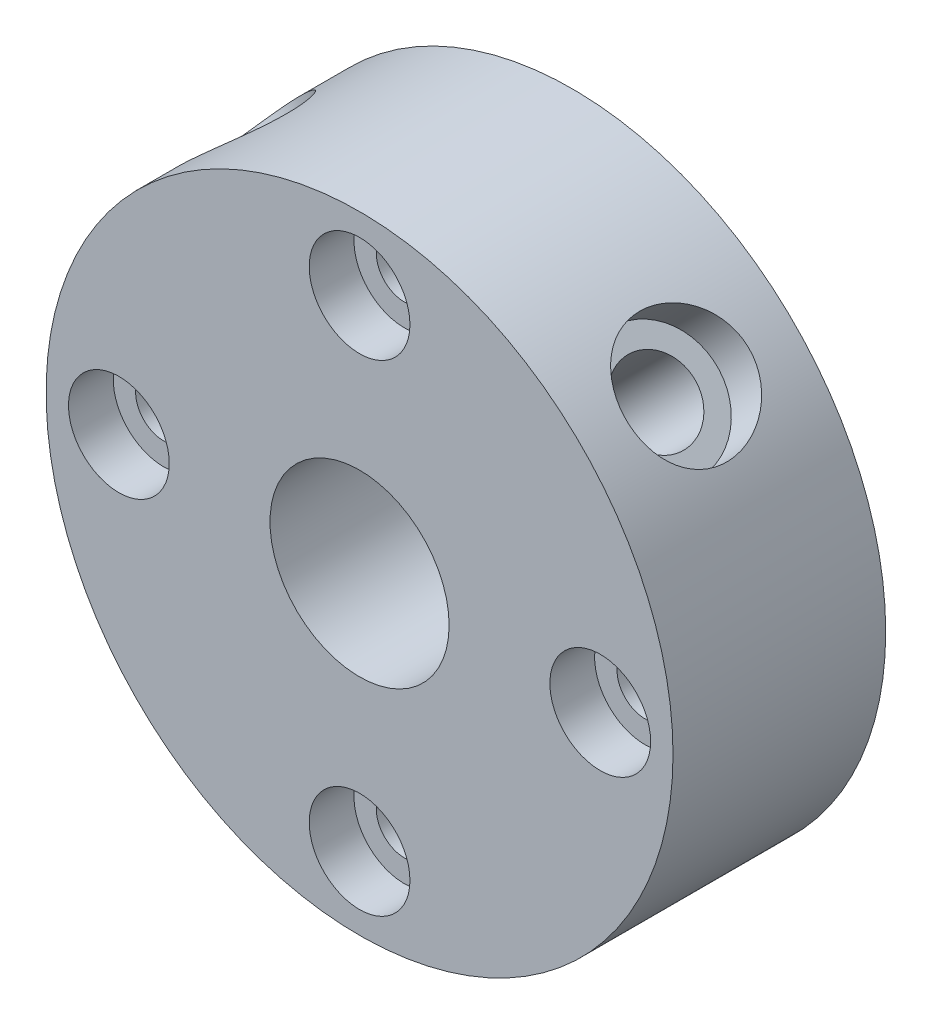
ISO-10303-21;
HEADER;
FILE_DESCRIPTION(('STEP AP214'),'2;1');
FILE_NAME('part.step','',(''),(''),'','','');
FILE_SCHEMA(('AUTOMOTIVE_DESIGN { 1 0 10303 214 1 1 1 1 }'));
ENDSEC;
DATA;
#1=APPLICATION_CONTEXT('core data for automotive mechanical design processes');
#2=APPLICATION_PROTOCOL_DEFINITION('international standard','automotive_design',2000,#1);
#3=PRODUCT_CONTEXT('',#1,'mechanical');
#4=PRODUCT('Part','Part','',(#3));
#5=PRODUCT_RELATED_PRODUCT_CATEGORY('part','',(#4));
#6=PRODUCT_DEFINITION_FORMATION('','',#4);
#7=PRODUCT_DEFINITION_CONTEXT('part definition',#1,'design');
#8=PRODUCT_DEFINITION('design','',#6,#7);
#9=PRODUCT_DEFINITION_SHAPE('','',#8);
#10=(LENGTH_UNIT() NAMED_UNIT(*) SI_UNIT(.MILLI.,.METRE.));
#11=(NAMED_UNIT(*) PLANE_ANGLE_UNIT() SI_UNIT($,.RADIAN.));
#12=(NAMED_UNIT(*) SI_UNIT($,.STERADIAN.) SOLID_ANGLE_UNIT());
#13=UNCERTAINTY_MEASURE_WITH_UNIT(LENGTH_MEASURE(1.E-05),#10,'distance_accuracy_value','');
#14=(GEOMETRIC_REPRESENTATION_CONTEXT(3) GLOBAL_UNCERTAINTY_ASSIGNED_CONTEXT((#13)) GLOBAL_UNIT_ASSIGNED_CONTEXT((#10,
#11,#12)) REPRESENTATION_CONTEXT('',''));
#15=CARTESIAN_POINT('',(0.,0.,0.));
#16=DIRECTION('',(0.,0.,1.));
#17=DIRECTION('',(1.,0.,0.));
#18=AXIS2_PLACEMENT_3D('',#15,#16,#17);
#19=CARTESIAN_POINT('',(0.707106781186545,-0.707106781186545,5.));
#20=DIRECTION('',(-0.707106781186549,0.707106781186546,0.));
#21=DIRECTION('',(-0.707106781186546,-0.707106781186549,0.));
#22=AXIS2_PLACEMENT_3D('',#19,#20,#21);
#23=CYLINDRICAL_SURFACE('',#22,1.75);
#24=CARTESIAN_POINT('',(-3.78081061074844,1.30593687659551,5.));
#25=CARTESIAN_POINT('',(-3.78081084278858,1.3059430821465,4.90716289442287));
#26=CARTESIAN_POINT('',(-3.77813198257498,1.31377205584543,4.81417157119662));
#27=CARTESIAN_POINT('',(-3.76729717141992,1.34451664459764,4.63091468094084));
#28=CARTESIAN_POINT('',(-3.75912707279636,1.36747122641772,4.54065678566668));
#29=CARTESIAN_POINT('',(-3.73703736828537,1.42672253507604,4.3658460553758));
#30=CARTESIAN_POINT('',(-3.72314281251786,1.46296105639329,4.28127020835369));
#31=CARTESIAN_POINT('',(-3.68915650153899,1.54665999872901,4.11928861684967));
#32=CARTESIAN_POINT('',(-3.66906577218776,1.59411856181478,4.04188168821309));
#33=CARTESIAN_POINT('',(-3.62067321922828,1.70128994869484,3.89106879758652));
#34=CARTESIAN_POINT('',(-3.59193721869166,1.76158268287214,3.81821397926124));
#35=CARTESIAN_POINT('',(-3.52620645608125,1.88972264856316,3.68368355010947));
#36=CARTESIAN_POINT('',(-3.4892083275388,1.957572953804,3.62201251481657));
#37=CARTESIAN_POINT('',(-3.4044738982276,2.10163387177016,3.50868513656312));
#38=CARTESIAN_POINT('',(-3.35630249260634,2.17809068798815,3.45766255804667));
#39=CARTESIAN_POINT('',(-3.25035659315262,2.33323458800924,3.37140885146062));
#40=CARTESIAN_POINT('',(-3.19258679638051,2.41192056540561,3.33617003048588));
#41=CARTESIAN_POINT('',(-3.07178507619373,2.56378813430028,3.28452419393086));
#42=CARTESIAN_POINT('',(-3.0092369722477,2.63702893485199,3.26716303885218));
#43=CARTESIAN_POINT('',(-2.87785552129489,2.77980980989489,3.24866837810413));
#44=CARTESIAN_POINT('',(-2.80902501699068,2.84935153584287,3.24752756922047));
#45=CARTESIAN_POINT('',(-2.67209905113881,2.97793934664758,3.26103640433386));
#46=CARTESIAN_POINT('',(-2.6042630776047,3.03737643271363,3.27463365916818));
#47=CARTESIAN_POINT('',(-2.46726327420831,3.14967621487697,3.3154102498973));
#48=CARTESIAN_POINT('',(-2.3980993464501,3.20253842411379,3.34259059085383));
#49=CARTESIAN_POINT('',(-2.25966585825002,3.30170827994595,3.41006356226138));
#50=CARTESIAN_POINT('',(-2.19041084596718,3.34790337392019,3.45055028773285));
#51=CARTESIAN_POINT('',(-2.05514952705827,3.43259934536681,3.54328377276071));
#52=CARTESIAN_POINT('',(-1.98914440895344,3.47109742348115,3.59553479628501));
#53=CARTESIAN_POINT('',(-1.85772725844884,3.54328844214748,3.71495328761213));
#54=CARTESIAN_POINT('',(-1.79274758513441,3.57638777961236,3.78295653631973));
#55=CARTESIAN_POINT('',(-1.67176663665093,3.63451654794417,3.9296255760914));
#56=CARTESIAN_POINT('',(-1.61576956757691,3.65954220383179,4.00829633057317));
#57=CARTESIAN_POINT('',(-1.51353321542069,3.70302998781292,4.17794260058652));
#58=CARTESIAN_POINT('',(-1.46776435099041,3.72119524583231,4.26928038179595));
#59=CARTESIAN_POINT('',(-1.39199223287073,3.75020303528781,4.45935009754533));
#60=CARTESIAN_POINT('',(-1.36197637474287,3.76105142315249,4.55807604809934));
#61=CARTESIAN_POINT('',(-1.32161514099458,3.77541580356085,4.75283070077687));
#62=CARTESIAN_POINT('',(-1.31005034449342,3.7793879848914,4.84857190324582));
#63=CARTESIAN_POINT('',(-1.30366611238261,3.78159649321503,5.04066000344493));
#64=CARTESIAN_POINT('',(-1.30883981719002,3.77983516984621,5.13700663691235));
#65=CARTESIAN_POINT('',(-1.33447813564537,3.77085180163904,5.32006311438135));
#66=CARTESIAN_POINT('',(-1.35378692773231,3.76404205673652,5.4069596428181));
#67=CARTESIAN_POINT('',(-1.40505988933185,3.74520319464596,5.57632940915253));
#68=CARTESIAN_POINT('',(-1.43702722639542,3.73317277101382,5.658801534061));
#69=CARTESIAN_POINT('',(-1.51347273956624,3.70285791908021,5.82107087084074));
#70=CARTESIAN_POINT('',(-1.55844171464083,3.68432042081538,5.9005884501779));
#71=CARTESIAN_POINT('',(-1.65798900273841,3.64060779982865,6.05136547846522));
#72=CARTESIAN_POINT('',(-1.71257175158321,3.61542961039424,6.12262109004358));
#73=CARTESIAN_POINT('',(-1.83447120791344,3.55524121737026,6.26164578778334));
#74=CARTESIAN_POINT('',(-1.90249603986576,3.51954228213818,6.32849960194522));
#75=CARTESIAN_POINT('',(-2.04449826371311,3.43899463065278,6.44914428383617));
#76=CARTESIAN_POINT('',(-2.1184763835839,3.3941447943827,6.50293355077419));
#77=CARTESIAN_POINT('',(-2.26996564682945,3.29476967495482,6.59608462508259));
#78=CARTESIAN_POINT('',(-2.34749760685506,3.24017990746769,6.63534455814212));
#79=CARTESIAN_POINT('',(-2.50239456939345,3.12209530781733,6.69727435093143));
#80=CARTESIAN_POINT('',(-2.57975964858296,3.05860641275324,6.71995520928519));
#81=CARTESIAN_POINT('',(-2.72541148232548,2.92931613259117,6.74659696219071));
#82=CARTESIAN_POINT('',(-2.79394221747387,2.86405321220751,6.7518444556949));
#83=CARTESIAN_POINT('',(-2.92590028813884,2.72910347377108,6.74700897845425));
#84=CARTESIAN_POINT('',(-2.98932868677344,2.65941758272597,6.73692921003997));
#85=CARTESIAN_POINT('',(-3.10685868709561,2.52097945623467,6.70264619700566));
#86=CARTESIAN_POINT('',(-3.16124024998574,2.45231108516381,6.67905438139825));
#87=CARTESIAN_POINT('',(-3.26291540278895,2.31531139902412,6.61911919383194));
#88=CARTESIAN_POINT('',(-3.31020771975289,2.24698014661366,6.58277353569061));
#89=CARTESIAN_POINT('',(-3.39939281318449,2.10977030038805,6.49652265103245));
#90=CARTESIAN_POINT('',(-3.44093912883819,2.04100994899528,6.44607267885892));
#91=CARTESIAN_POINT('',(-3.51610392672964,1.9086168601797,6.33380569373778));
#92=CARTESIAN_POINT('',(-3.54971913059349,1.84498625029647,6.27198399894363));
#93=CARTESIAN_POINT('',(-3.61174275897369,1.7206118415727,6.1332043029573));
#94=CARTESIAN_POINT('',(-3.63956040632245,1.6604560672058,6.05545252420228));
#95=CARTESIAN_POINT('',(-3.68725637832902,1.55167030305855,5.88996809699007));
#96=CARTESIAN_POINT('',(-3.707129908907,1.5030472801858,5.80222946261369));
#97=CARTESIAN_POINT('',(-3.73963056706925,1.42026564271892,5.61876002969818));
#98=CARTESIAN_POINT('',(-3.75224863454028,1.38612512674762,5.52301940888121));
#99=CARTESIAN_POINT('',(-3.77070212928644,1.33512672554198,5.32659470551519));
#100=CARTESIAN_POINT('',(-3.77656031839076,1.3182108642936,5.2259284095019));
#101=CARTESIAN_POINT('',(-3.77973309151228,1.30905147442094,5.10393550397992));
#102=CARTESIAN_POINT('',(-3.78013720055102,1.30788503200576,5.08316991294979));
#103=CARTESIAN_POINT('',(-3.78067593714786,1.30632702912848,5.0416054638579));
#104=CARTESIAN_POINT('',(-3.78081055874372,1.30593548581056,5.0208066050703));
#105=CARTESIAN_POINT('',(-3.78081061074844,1.30593687659551,5.));
#106=B_SPLINE_CURVE_WITH_KNOTS('',3,(#24,#25,#26,#27,#28,#29,#30,#31,#32,#33,#34,#35,#36,#37,
#38,#39,#40,#41,#42,#43,#44,#45,#46,#47,#48,#49,#50,#51,#52,#53,#54,#55,#56,#57,#58,#59,#60,#61,
#62,#63,#64,#65,#66,#67,#68,#69,#70,#71,#72,#73,#74,#75,#76,#77,#78,#79,#80,#81,#82,#83,#84,#85,
#86,#87,#88,#89,#90,#91,#92,#93,#94,#95,#96,#97,#98,#99,#100,#101,#102,#103,#104,#105),
.UNSPECIFIED.,.T.,.F.,(4,2,2,2,2,2,2,2,2,2,2,2,2,2,2,2,2,2,2,2,2,2,2,2,2,2,2,2,2,2,2,2,2,2,2,2,
2,2,2,2,4),(0.,0.278423709089656,0.557567515667148,0.835502554114349,1.11339160134648,
1.40862253901942,1.70397399105099,2.01370508313311,2.32328504950115,2.6153188205415,
2.90722109914898,3.17957432675714,3.45194770975124,3.72848484888748,4.00512238068054,
4.30294103546421,4.60089873899835,4.91057566441317,5.22000442909255,5.50798165433932,
5.79584087897396,6.06247089944838,6.32916768102552,6.60765996633827,6.88628108699589,
7.19039073128141,7.49453761916006,7.80077838726026,8.10681580917881,8.38969680616703,
8.67251870884305,8.94345335784295,9.21443659790207,9.49782974545364,9.78133983087841,
10.0864214236492,10.3916868487401,10.6973326446402,11.0019462404003,11.0643450405093,
11.12674522114),.UNSPECIFIED.);
#107=CARTESIAN_POINT('',(-3.78081061074844,1.30593687659551,5.));
#108=VERTEX_POINT('',#107);
#109=EDGE_CURVE('E116',#108,#108,#106,.T.);
#110=ORIENTED_EDGE('',*,*,#109,.T.);
#111=EDGE_LOOP('',(#110));
#112=FACE_BOUND('',#111,.T.);
#113=CARTESIAN_POINT('',(-8.48528137423859,8.48528137423855,5.));
#114=DIRECTION('',(-0.707106781186549,0.707106781186546,0.));
#115=DIRECTION('',(-0.707106781186546,-0.707106781186549,0.));
#116=AXIS2_PLACEMENT_3D('',#113,#114,#115);
#117=CIRCLE('',#116,1.75);
#118=CARTESIAN_POINT('',(-9.72271824131504,7.24784450716209,5.));
#119=VERTEX_POINT('',#118);
#120=EDGE_CURVE('E67',#119,#119,#117,.F.);
#121=ORIENTED_EDGE('',*,*,#120,.F.);
#122=EDGE_LOOP('',(#121));
#123=FACE_BOUND('',#122,.T.);
#124=ADVANCED_FACE('F37',(#112,#123),#23,.F.);
#125=CARTESIAN_POINT('',(-0.707106781186547,-0.707106781186548,4.75));
#126=DIRECTION('',(0.707106781186546,0.707106781186549,0.));
#127=DIRECTION('',(-0.707106781186549,0.707106781186546,0.));
#128=AXIS2_PLACEMENT_3D('',#125,#126,#127);
#129=CYLINDRICAL_SURFACE('',#128,1.75);
#130=CARTESIAN_POINT('',(1.30593687659551,3.78081061074844,4.75));
#131=CARTESIAN_POINT('',(1.30594308214651,3.78081084278858,4.65716289442287));
#132=CARTESIAN_POINT('',(1.31377205584543,3.77813198257498,4.56417157119662));
#133=CARTESIAN_POINT('',(1.34451664459764,3.76729717141992,4.38091468094084));
#134=CARTESIAN_POINT('',(1.36747122641773,3.75912707279636,4.29065678566668));
#135=CARTESIAN_POINT('',(1.42672253507604,3.73703736828537,4.1158460553758));
#136=CARTESIAN_POINT('',(1.4629610563933,3.72314281251786,4.03127020835369));
#137=CARTESIAN_POINT('',(1.54665999872901,3.68915650153899,3.86928861684967));
#138=CARTESIAN_POINT('',(1.59411856181478,3.66906577218776,3.79188168821309));
#139=CARTESIAN_POINT('',(1.70128994869484,3.62067321922828,3.64106879758652));
#140=CARTESIAN_POINT('',(1.76158268287214,3.59193721869166,3.56821397926124));
#141=CARTESIAN_POINT('',(1.88972264856316,3.52620645608124,3.43368355010947));
#142=CARTESIAN_POINT('',(1.957572953804,3.4892083275388,3.37201251481657));
#143=CARTESIAN_POINT('',(2.10163387177016,3.4044738982276,3.25868513656312));
#144=CARTESIAN_POINT('',(2.17809068798815,3.35630249260634,3.20766255804667));
#145=CARTESIAN_POINT('',(2.33323458800924,3.25035659315262,3.12140885146063));
#146=CARTESIAN_POINT('',(2.41192056540561,3.1925867963805,3.08617003048588));
#147=CARTESIAN_POINT('',(2.56378813430028,3.07178507619373,3.03452419393086));
#148=CARTESIAN_POINT('',(2.63702893485199,3.0092369722477,3.01716303885218));
#149=CARTESIAN_POINT('',(2.77980980989489,2.87785552129489,2.99866837810413));
#150=CARTESIAN_POINT('',(2.84935153584287,2.80902501699068,2.99752756922047));
#151=CARTESIAN_POINT('',(2.97793934664758,2.67209905113881,3.01103640433386));
#152=CARTESIAN_POINT('',(3.03737643271363,2.6042630776047,3.02463365916818));
#153=CARTESIAN_POINT('',(3.14967621487697,2.46726327420831,3.0654102498973));
#154=CARTESIAN_POINT('',(3.20253842411379,2.3980993464501,3.09259059085383));
#155=CARTESIAN_POINT('',(3.30170827994595,2.25966585825002,3.16006356226138));
#156=CARTESIAN_POINT('',(3.34790337392019,2.19041084596718,3.20055028773285));
#157=CARTESIAN_POINT('',(3.43259934536681,2.05514952705827,3.29328377276071));
#158=CARTESIAN_POINT('',(3.47109742348115,1.98914440895344,3.34553479628501));
#159=CARTESIAN_POINT('',(3.54328844214748,1.85772725844884,3.46495328761213));
#160=CARTESIAN_POINT('',(3.57638777961236,1.79274758513441,3.53295653631973));
#161=CARTESIAN_POINT('',(3.63451654794417,1.67176663665093,3.6796255760914));
#162=CARTESIAN_POINT('',(3.65954220383179,1.61576956757691,3.75829633057318));
#163=CARTESIAN_POINT('',(3.70302998781292,1.51353321542069,3.92794260058652));
#164=CARTESIAN_POINT('',(3.72119524583231,1.46776435099041,4.01928038179595));
#165=CARTESIAN_POINT('',(3.75020303528781,1.39199223287073,4.20935009754533));
#166=CARTESIAN_POINT('',(3.76105142315249,1.36197637474287,4.30807604809934));
#167=CARTESIAN_POINT('',(3.77541580356085,1.32161514099458,4.50283070077687));
#168=CARTESIAN_POINT('',(3.7793879848914,1.31005034449342,4.59857190324582));
#169=CARTESIAN_POINT('',(3.78159649321503,1.30366611238261,4.79066000344493));
#170=CARTESIAN_POINT('',(3.77983516984621,1.30883981719002,4.88700663691235));
#171=CARTESIAN_POINT('',(3.77085180163904,1.33447813564537,5.07006311438135));
#172=CARTESIAN_POINT('',(3.76404205673652,1.35378692773231,5.1569596428181));
#173=CARTESIAN_POINT('',(3.74520319464596,1.40505988933184,5.32632940915253));
#174=CARTESIAN_POINT('',(3.73317277101382,1.43702722639542,5.408801534061));
#175=CARTESIAN_POINT('',(3.70285791908021,1.51347273956624,5.57107087084074));
#176=CARTESIAN_POINT('',(3.68432042081538,1.55844171464083,5.65058845017791));
#177=CARTESIAN_POINT('',(3.64060779982865,1.65798900273841,5.80136547846522));
#178=CARTESIAN_POINT('',(3.61542961039424,1.71257175158321,5.87262109004358));
#179=CARTESIAN_POINT('',(3.55524121737026,1.83447120791344,6.01164578778333));
#180=CARTESIAN_POINT('',(3.51954228213818,1.90249603986576,6.07849960194522));
#181=CARTESIAN_POINT('',(3.43899463065278,2.04449826371311,6.19914428383617));
#182=CARTESIAN_POINT('',(3.3941447943827,2.1184763835839,6.25293355077419));
#183=CARTESIAN_POINT('',(3.29476967495482,2.26996564682945,6.34608462508259));
#184=CARTESIAN_POINT('',(3.24017990746769,2.34749760685506,6.38534455814212));
#185=CARTESIAN_POINT('',(3.12209530781733,2.50239456939345,6.44727435093143));
#186=CARTESIAN_POINT('',(3.05860641275323,2.57975964858295,6.46995520928519));
#187=CARTESIAN_POINT('',(2.92931613259117,2.72541148232548,6.49659696219071));
#188=CARTESIAN_POINT('',(2.86405321220751,2.79394221747387,6.5018444556949));
#189=CARTESIAN_POINT('',(2.72910347377108,2.92590028813884,6.49700897845425));
#190=CARTESIAN_POINT('',(2.65941758272597,2.98932868677344,6.48692921003997));
#191=CARTESIAN_POINT('',(2.52097945623467,3.10685868709562,6.45264619700566));
#192=CARTESIAN_POINT('',(2.45231108516381,3.16124024998574,6.42905438139824));
#193=CARTESIAN_POINT('',(2.31531139902412,3.26291540278895,6.36911919383194));
#194=CARTESIAN_POINT('',(2.24698014661366,3.31020771975289,6.3327735356906));
#195=CARTESIAN_POINT('',(2.10977030038805,3.39939281318449,6.24652265103245));
#196=CARTESIAN_POINT('',(2.04100994899528,3.44093912883819,6.19607267885892));
#197=CARTESIAN_POINT('',(1.9086168601797,3.51610392672964,6.08380569373778));
#198=CARTESIAN_POINT('',(1.84498625029647,3.54971913059349,6.02198399894363));
#199=CARTESIAN_POINT('',(1.7206118415727,3.61174275897369,5.8832043029573));
#200=CARTESIAN_POINT('',(1.6604560672058,3.63956040632245,5.80545252420228));
#201=CARTESIAN_POINT('',(1.55167030305855,3.68725637832902,5.63996809699007));
#202=CARTESIAN_POINT('',(1.5030472801858,3.707129908907,5.55222946261369));
#203=CARTESIAN_POINT('',(1.42026564271892,3.73963056706925,5.36876002969818));
#204=CARTESIAN_POINT('',(1.38612512674762,3.75224863454028,5.27301940888121));
#205=CARTESIAN_POINT('',(1.33512672554198,3.77070212928644,5.07659470551519));
#206=CARTESIAN_POINT('',(1.31821086429361,3.77656031839076,4.97592840950189));
#207=CARTESIAN_POINT('',(1.30905147442094,3.77973309151228,4.85393550397992));
#208=CARTESIAN_POINT('',(1.30788503200576,3.78013720055102,4.83316991294979));
#209=CARTESIAN_POINT('',(1.30632702912848,3.78067593714786,4.7916054638579));
#210=CARTESIAN_POINT('',(1.30593548581056,3.78081055874372,4.7708066050703));
#211=CARTESIAN_POINT('',(1.30593687659551,3.78081061074844,4.75));
#212=B_SPLINE_CURVE_WITH_KNOTS('',3,(#130,#131,#132,#133,#134,#135,#136,#137,#138,#139,#140,
#141,#142,#143,#144,#145,#146,#147,#148,#149,#150,#151,#152,#153,#154,#155,#156,#157,#158,#159,
#160,#161,#162,#163,#164,#165,#166,#167,#168,#169,#170,#171,#172,#173,#174,#175,#176,#177,#178,
#179,#180,#181,#182,#183,#184,#185,#186,#187,#188,#189,#190,#191,#192,#193,#194,#195,#196,#197,
#198,#199,#200,#201,#202,#203,#204,#205,#206,#207,#208,#209,#210,#211),.UNSPECIFIED.,.T.,.F.,(4,
2,2,2,2,2,2,2,2,2,2,2,2,2,2,2,2,2,2,2,2,2,2,2,2,2,2,2,2,2,2,2,2,2,2,2,2,2,2,2,4),(0.,
0.278423709089656,0.557567515667148,0.835502554114349,1.11339160134648,1.40862253901942,
1.70397399105099,2.01370508313311,2.32328504950115,2.6153188205415,2.90722109914897,
3.17957432675714,3.45194770975124,3.72848484888748,4.00512238068054,4.30294103546421,
4.60089873899834,4.91057566441316,5.22000442909255,5.50798165433931,5.79584087897396,
6.06247089944839,6.32916768102552,6.60765996633827,6.88628108699589,7.1903907312814,
7.49453761916006,7.80077838726026,8.10681580917881,8.38969680616703,8.67251870884305,
8.94345335784295,9.21443659790207,9.49782974545364,9.78133983087841,10.0864214236492,
10.3916868487401,10.6973326446402,11.0019462404003,11.0643450405093,11.12674522114),.UNSPECIFIED.);
#213=CARTESIAN_POINT('',(1.30593687659551,3.78081061074844,4.75));
#214=VERTEX_POINT('',#213);
#215=EDGE_CURVE('E124',#214,#214,#212,.T.);
#216=ORIENTED_EDGE('',*,*,#215,.T.);
#217=EDGE_LOOP('',(#216));
#218=FACE_BOUND('',#217,.T.);
#219=CARTESIAN_POINT('',(8.48528137423855,8.48528137423859,4.75));
#220=DIRECTION('',(0.707106781186546,0.707106781186549,0.));
#221=DIRECTION('',(-0.707106781186549,0.707106781186546,0.));
#222=AXIS2_PLACEMENT_3D('',#219,#220,#221);
#223=CIRCLE('',#222,1.75);
#224=CARTESIAN_POINT('',(7.24784450716209,9.72271824131504,4.75));
#225=VERTEX_POINT('',#224);
#226=EDGE_CURVE('E65',#225,#225,#223,.F.);
#227=ORIENTED_EDGE('',*,*,#226,.F.);
#228=EDGE_LOOP('',(#227));
#229=FACE_BOUND('',#228,.T.);
#230=ADVANCED_FACE('F111',(#218,#229),#129,.F.);
#231=CARTESIAN_POINT('',(-10.75,0.,0.));
#232=DIRECTION('',(0.,0.,1.));
#233=DIRECTION('',(1.,0.,0.));
#234=AXIS2_PLACEMENT_3D('',#231,#232,#233);
#235=CYLINDRICAL_SURFACE('',#234,1.25);
#236=CARTESIAN_POINT('',(-10.75,0.,0.));
#237=DIRECTION('',(0.,0.,1.));
#238=DIRECTION('',(1.,0.,0.));
#239=AXIS2_PLACEMENT_3D('',#236,#237,#238);
#240=CIRCLE('',#239,1.25);
#241=CARTESIAN_POINT('',(-9.5,0.,0.));
#242=VERTEX_POINT('',#241);
#243=EDGE_CURVE('E166',#242,#242,#240,.T.);
#244=ORIENTED_EDGE('',*,*,#243,.F.);
#245=EDGE_LOOP('',(#244));
#246=FACE_BOUND('',#245,.T.);
#247=CARTESIAN_POINT('',(-10.75,0.,7.5));
#248=DIRECTION('',(0.,0.,1.));
#249=DIRECTION('',(1.,0.,0.));
#250=AXIS2_PLACEMENT_3D('',#247,#248,#249);
#251=CIRCLE('',#250,1.25);
#252=CARTESIAN_POINT('',(-9.5,0.,7.5));
#253=VERTEX_POINT('',#252);
#254=EDGE_CURVE('E125',#253,#253,#251,.F.);
#255=ORIENTED_EDGE('',*,*,#254,.F.);
#256=EDGE_LOOP('',(#255));
#257=FACE_BOUND('',#256,.T.);
#258=ADVANCED_FACE('F253',(#246,#257),#235,.F.);
#259=CARTESIAN_POINT('',(0.,-10.75,0.));
#260=DIRECTION('',(0.,0.,1.));
#261=DIRECTION('',(1.,0.,0.));
#262=AXIS2_PLACEMENT_3D('',#259,#260,#261);
#263=CYLINDRICAL_SURFACE('',#262,1.25);
#264=CARTESIAN_POINT('',(0.,-10.75,0.));
#265=DIRECTION('',(0.,0.,1.));
#266=DIRECTION('',(1.,0.,0.));
#267=AXIS2_PLACEMENT_3D('',#264,#265,#266);
#268=CIRCLE('',#267,1.25);
#269=CARTESIAN_POINT('',(1.25,-10.75,0.));
#270=VERTEX_POINT('',#269);
#271=EDGE_CURVE('E162',#270,#270,#268,.T.);
#272=ORIENTED_EDGE('',*,*,#271,.F.);
#273=EDGE_LOOP('',(#272));
#274=FACE_BOUND('',#273,.T.);
#275=CARTESIAN_POINT('',(0.,-10.75,7.5));
#276=DIRECTION('',(0.,0.,1.));
#277=DIRECTION('',(1.,0.,0.));
#278=AXIS2_PLACEMENT_3D('',#275,#276,#277);
#279=CIRCLE('',#278,1.25);
#280=CARTESIAN_POINT('',(1.25,-10.75,7.5));
#281=VERTEX_POINT('',#280);
#282=EDGE_CURVE('E468',#281,#281,#279,.F.);
#283=ORIENTED_EDGE('',*,*,#282,.F.);
#284=EDGE_LOOP('',(#283));
#285=FACE_BOUND('',#284,.T.);
#286=ADVANCED_FACE('F258',(#274,#285),#263,.F.);
#287=CARTESIAN_POINT('',(10.75,0.,0.));
#288=DIRECTION('',(0.,0.,1.));
#289=DIRECTION('',(1.,0.,0.));
#290=AXIS2_PLACEMENT_3D('',#287,#288,#289);
#291=CYLINDRICAL_SURFACE('',#290,1.25);
#292=CARTESIAN_POINT('',(10.75,0.,0.));
#293=DIRECTION('',(0.,0.,1.));
#294=DIRECTION('',(1.,0.,0.));
#295=AXIS2_PLACEMENT_3D('',#292,#293,#294);
#296=CIRCLE('',#295,1.25);
#297=CARTESIAN_POINT('',(12.,0.,0.));
#298=VERTEX_POINT('',#297);
#299=EDGE_CURVE('E158',#298,#298,#296,.T.);
#300=ORIENTED_EDGE('',*,*,#299,.F.);
#301=EDGE_LOOP('',(#300));
#302=FACE_BOUND('',#301,.T.);
#303=CARTESIAN_POINT('',(10.75,0.,7.5));
#304=DIRECTION('',(0.,0.,1.));
#305=DIRECTION('',(1.,0.,0.));
#306=AXIS2_PLACEMENT_3D('',#303,#304,#305);
#307=CIRCLE('',#306,1.25);
#308=CARTESIAN_POINT('',(12.,0.,7.5));
#309=VERTEX_POINT('',#308);
#310=EDGE_CURVE('E466',#309,#309,#307,.F.);
#311=ORIENTED_EDGE('',*,*,#310,.F.);
#312=EDGE_LOOP('',(#311));
#313=FACE_BOUND('',#312,.T.);
#314=ADVANCED_FACE('F270',(#302,#313),#291,.F.);
#315=CARTESIAN_POINT('',(0.,10.75,0.));
#316=DIRECTION('',(0.,0.,1.));
#317=DIRECTION('',(1.,0.,0.));
#318=AXIS2_PLACEMENT_3D('',#315,#316,#317);
#319=CYLINDRICAL_SURFACE('',#318,1.25);
#320=CARTESIAN_POINT('',(0.,10.75,0.));
#321=DIRECTION('',(0.,0.,1.));
#322=DIRECTION('',(1.,0.,0.));
#323=AXIS2_PLACEMENT_3D('',#320,#321,#322);
#324=CIRCLE('',#323,1.25);
#325=CARTESIAN_POINT('',(1.25,10.75,0.));
#326=VERTEX_POINT('',#325);
#327=EDGE_CURVE('E154',#326,#326,#324,.T.);
#328=ORIENTED_EDGE('',*,*,#327,.F.);
#329=EDGE_LOOP('',(#328));
#330=FACE_BOUND('',#329,.T.);
#331=CARTESIAN_POINT('',(0.,10.75,7.5));
#332=DIRECTION('',(0.,0.,1.));
#333=DIRECTION('',(1.,0.,0.));
#334=AXIS2_PLACEMENT_3D('',#331,#332,#333);
#335=CIRCLE('',#334,1.25);
#336=CARTESIAN_POINT('',(1.25,10.75,7.5));
#337=VERTEX_POINT('',#336);
#338=EDGE_CURVE('E130',#337,#337,#335,.F.);
#339=ORIENTED_EDGE('',*,*,#338,.F.);
#340=EDGE_LOOP('',(#339));
#341=FACE_BOUND('',#340,.T.);
#342=ADVANCED_FACE('F150',(#330,#341),#319,.F.);
#343=CARTESIAN_POINT('',(0.,0.,2.));
#344=DIRECTION('',(0.,0.,-1.));
#345=DIRECTION('',(-1.,0.,0.));
#346=AXIS2_PLACEMENT_3D('',#343,#344,#345);
#347=CYLINDRICAL_SURFACE('',#346,14.);
#348=CARTESIAN_POINT('',(-11.6511779774216,7.76209068089556,5.));
#349=CARTESIAN_POINT('',(-11.6511760710743,7.76209685743818,4.84713864487768));
#350=CARTESIAN_POINT('',(-11.6439600918152,7.77295873329219,4.69420467965564));
#351=CARTESIAN_POINT('',(-11.6151562478213,7.81593176789737,4.39265905280335));
#352=CARTESIAN_POINT('',(-11.5935566814567,7.84806022774672,4.24405101331165));
#353=CARTESIAN_POINT('',(-11.5362296800744,7.9320849840361,3.95556360702522));
#354=CARTESIAN_POINT('',(-11.5005160354634,7.9839619830083,3.8156758739027));
#355=CARTESIAN_POINT('',(-11.4153350658881,8.10528188694974,3.54828223466166));
#356=CARTESIAN_POINT('',(-11.3658685973735,8.17472369805544,3.4207755581864));
#357=CARTESIAN_POINT('',(-11.2530317647504,8.32937722105698,3.1800161059738));
#358=CARTESIAN_POINT('',(-11.1894986642951,8.4147715125977,3.06695685091667));
#359=CARTESIAN_POINT('',(-11.0496963781696,8.59752415467707,2.85999006066215));
#360=CARTESIAN_POINT('',(-10.9734263172008,8.69488332733456,2.76608384266932));
#361=CARTESIAN_POINT('',(-10.8086291445262,8.89892412332568,2.59934056719733));
#362=CARTESIAN_POINT('',(-10.7200045154781,9.00567714337162,2.52668699234182));
#363=CARTESIAN_POINT('',(-10.5327025177477,9.22403606803345,2.40569481193111));
#364=CARTESIAN_POINT('',(-10.4340260574771,9.33564153359888,2.35735401150367));
#365=CARTESIAN_POINT('',(-10.2302260166266,9.55850280250496,2.28696085636299));
#366=CARTESIAN_POINT('',(-10.125200430248,9.66974499008799,2.26458187495326));
#367=CARTESIAN_POINT('',(-9.91038456070153,9.88978808390079,2.24572894559391));
#368=CARTESIAN_POINT('',(-9.80059472202804,9.99858921644498,2.24925258612951));
#369=CARTESIAN_POINT('',(-9.58102744775139,10.2091500460516,2.2818563354567));
#370=CARTESIAN_POINT('',(-9.4712705661895,10.3109859487607,2.31058465450608));
#371=CARTESIAN_POINT('',(-9.25368197503286,10.5067024995948,2.39222474936271));
#372=CARTESIAN_POINT('',(-9.14585034068459,10.6005828373187,2.44513746825414));
#373=CARTESIAN_POINT('',(-8.93496579021392,10.7789421572765,2.57397297266082));
#374=CARTESIAN_POINT('',(-8.83194610420595,10.8633601811193,2.65003439842101));
#375=CARTESIAN_POINT('',(-8.6348846554936,11.0206482091051,2.82290575092377));
#376=CARTESIAN_POINT('',(-8.54084389264235,11.0935169277635,2.91971798449848));
#377=CARTESIAN_POINT('',(-8.36359389448011,11.2277730733744,3.13327523820785));
#378=CARTESIAN_POINT('',(-8.28059342328153,11.2889467968924,3.25032810568758));
#379=CARTESIAN_POINT('',(-8.13053710814367,11.3974983784731,3.50002375031689));
#380=CARTESIAN_POINT('',(-8.06348154485832,11.4448759937072,3.63266680181535));
#381=CARTESIAN_POINT('',(-7.9479795776025,11.5253898480945,3.91019695454488));
#382=CARTESIAN_POINT('',(-7.89957076518362,11.5584973347093,4.05510807845731));
#383=CARTESIAN_POINT('',(-7.82372493303534,11.6099720242653,4.35281950411177));
#384=CARTESIAN_POINT('',(-7.79628528514657,11.6283410744552,4.50561881462842));
#385=CARTESIAN_POINT('',(-7.76393296601738,11.6499665945253,4.81206569919599));
#386=CARTESIAN_POINT('',(-7.75865572008286,11.6534676558465,4.96565758188245));
#387=CARTESIAN_POINT('',(-7.76987377383254,11.6459909608475,5.27168243713359));
#388=CARTESIAN_POINT('',(-7.78636788530818,11.6350139946901,5.42411547248767));
#389=CARTESIAN_POINT('',(-7.84010957468696,11.5988664947171,5.72205705658004));
#390=CARTESIAN_POINT('',(-7.87716491147389,11.5738274114488,5.86761639167118));
#391=CARTESIAN_POINT('',(-7.97027158902165,11.5099061771373,6.14931251813332));
#392=CARTESIAN_POINT('',(-8.02632444711121,11.4710229203497,6.28544855582098));
#393=CARTESIAN_POINT('',(-8.15593958330598,11.3792359676262,6.54632225600289));
#394=CARTESIAN_POINT('',(-8.229713598075,11.3261617735526,6.67089467042176));
#395=CARTESIAN_POINT('',(-8.39149189120414,11.2068257799823,6.90337678166906));
#396=CARTESIAN_POINT('',(-8.47949757981278,11.1405626734163,7.01128482511373));
#397=CARTESIAN_POINT('',(-8.66788418245452,10.9946423388,7.20900125477127));
#398=CARTESIAN_POINT('',(-8.76842864337674,10.9148017777596,7.29851884805999));
#399=CARTESIAN_POINT('',(-8.97720229742934,10.7437434762889,7.45485372190564));
#400=CARTESIAN_POINT('',(-9.085431175118,10.6525262027513,7.52167193361096));
#401=CARTESIAN_POINT('',(-9.30519361072117,10.4610931191872,7.63028411926557));
#402=CARTESIAN_POINT('',(-9.41670517858037,10.3609307606668,7.67221661584114));
#403=CARTESIAN_POINT('',(-9.63990993584737,10.1535865474959,7.73030692396769));
#404=CARTESIAN_POINT('',(-9.75160310268626,10.0464055084653,7.74646772485652));
#405=CARTESIAN_POINT('',(-9.96983508695565,9.82983362934317,7.75244353036993));
#406=CARTESIAN_POINT('',(-10.0764289582517,9.72051010286402,7.74269630858576));
#407=CARTESIAN_POINT('',(-10.2834877072507,9.50119100225686,7.69809707740773));
#408=CARTESIAN_POINT('',(-10.3839526564767,9.39119543598788,7.66324536103783));
#409=CARTESIAN_POINT('',(-10.5761187560898,9.17424036262302,7.56961812143022));
#410=CARTESIAN_POINT('',(-10.6678380278224,9.06727491541163,7.51089345488584));
#411=CARTESIAN_POINT('',(-10.8409023167005,8.85963471236125,7.37124177050664));
#412=CARTESIAN_POINT('',(-10.9222465491039,8.75896043266396,7.29031307467129));
#413=CARTESIAN_POINT('',(-11.0743849957406,8.56582542357789,7.10706506634693));
#414=CARTESIAN_POINT('',(-11.1449947627056,8.47351738730983,7.00443165263271));
#415=CARTESIAN_POINT('',(-11.2731371218947,8.30227954812329,6.78133486969797));
#416=CARTESIAN_POINT('',(-11.3306666202923,8.2233529113769,6.66086729333251));
#417=CARTESIAN_POINT('',(-11.4324685887437,8.08123775287278,6.40403136397606));
#418=CARTESIAN_POINT('',(-11.476598111931,8.0182200631203,6.26751173827291));
#419=CARTESIAN_POINT('',(-11.550271244279,7.91172932739614,5.98345773398099));
#420=CARTESIAN_POINT('',(-11.5798282437361,7.86823834216193,5.83593361120005));
#421=CARTESIAN_POINT('',(-11.6183350585297,7.81121771647316,5.57337110652133));
#422=CARTESIAN_POINT('',(-11.6306426848372,7.79284092765964,5.45984220063522));
#423=CARTESIAN_POINT('',(-11.6470647322009,7.76827527357894,5.23088929870786));
#424=CARTESIAN_POINT('',(-11.6511794174002,7.7620860153819,5.11546536388394));
#425=CARTESIAN_POINT('',(-11.6511779774216,7.76209068089556,5.));
#426=B_SPLINE_CURVE_WITH_KNOTS('',3,(#348,#349,#350,#351,#352,#353,#354,#355,#356,#357,#358,
#359,#360,#361,#362,#363,#364,#365,#366,#367,#368,#369,#370,#371,#372,#373,#374,#375,#376,#377,
#378,#379,#380,#381,#382,#383,#384,#385,#386,#387,#388,#389,#390,#391,#392,#393,#394,#395,#396,
#397,#398,#399,#400,#401,#402,#403,#404,#405,#406,#407,#408,#409,#410,#411,#412,#413,#414,#415,
#416,#417,#418,#419,#420,#421,#422,#423,#424,#425),.UNSPECIFIED.,.T.,.F.,(4,2,2,2,2,2,2,2,2,2,2,
2,2,2,2,2,2,2,2,2,2,2,2,2,2,2,2,2,2,2,2,2,2,2,2,2,2,2,4),(0.,0.458161359266159,
0.916695907427622,1.37478353967289,1.83284265114413,2.29650709300992,2.76020341155038,
3.22779223307661,3.69533883473926,4.15693714034927,4.61849247204569,5.07370641763774,
5.52893811606669,5.98695177036365,6.44501636769502,6.91078471215003,7.37656125420932,
7.84327194031395,8.30992412187866,8.76886898779822,9.22778880706281,9.68248845652962,
10.1372244313406,10.5976905575203,11.0582023403144,11.5255141630079,11.9928068138484,
12.4574733411489,12.9220859664357,13.3788980434201,13.8357047885022,14.291543452743,
14.7474165750679,15.2104037928827,15.6735004056529,16.141376409648,16.6088216900946,
16.9549096446048,17.3009864409468),.UNSPECIFIED.);
#427=CARTESIAN_POINT('',(-11.6511779774216,7.76209068089556,5.));
#428=VERTEX_POINT('',#427);
#429=EDGE_CURVE('E10',#428,#428,#426,.T.);
#430=ORIENTED_EDGE('',*,*,#429,.T.);
#431=EDGE_LOOP('',(#430));
#432=FACE_BOUND('',#431,.T.);
#433=CARTESIAN_POINT('',(7.76209068089556,11.6511779774216,4.75));
#434=CARTESIAN_POINT('',(7.76209685743817,11.6511760710743,4.59713864487768));
#435=CARTESIAN_POINT('',(7.77295873329218,11.6439600918152,4.44420467965564));
#436=CARTESIAN_POINT('',(7.81593176789736,11.6151562478213,4.14265905280335));
#437=CARTESIAN_POINT('',(7.84806022774672,11.5935566814567,3.99405101331165));
#438=CARTESIAN_POINT('',(7.9320849840361,11.5362296800744,3.70556360702522));
#439=CARTESIAN_POINT('',(7.9839619830083,11.5005160354634,3.5656758739027));
#440=CARTESIAN_POINT('',(8.10528188694973,11.4153350658881,3.29828223466166));
#441=CARTESIAN_POINT('',(8.17472369805544,11.3658685973735,3.1707755581864));
#442=CARTESIAN_POINT('',(8.32937722105697,11.2530317647504,2.9300161059738));
#443=CARTESIAN_POINT('',(8.41477151259769,11.1894986642951,2.81695685091667));
#444=CARTESIAN_POINT('',(8.59752415467706,11.0496963781696,2.60999006066215));
#445=CARTESIAN_POINT('',(8.69488332733455,10.9734263172008,2.51608384266932));
#446=CARTESIAN_POINT('',(8.89892412332567,10.8086291445262,2.34934056719733));
#447=CARTESIAN_POINT('',(9.00567714337162,10.7200045154781,2.27668699234182));
#448=CARTESIAN_POINT('',(9.22403606803344,10.5327025177477,2.15569481193111));
#449=CARTESIAN_POINT('',(9.33564153359888,10.4340260574771,2.10735401150367));
#450=CARTESIAN_POINT('',(9.55850280250495,10.2302260166266,2.03696085636299));
#451=CARTESIAN_POINT('',(9.66974499008799,10.125200430248,2.01458187495326));
#452=CARTESIAN_POINT('',(9.88978808390079,9.91038456070153,1.99572894559391));
#453=CARTESIAN_POINT('',(9.99858921644497,9.80059472202805,1.99925258612951));
#454=CARTESIAN_POINT('',(10.2091500460516,9.58102744775139,2.0318563354567));
#455=CARTESIAN_POINT('',(10.3109859487607,9.47127056618951,2.06058465450608));
#456=CARTESIAN_POINT('',(10.5067024995948,9.25368197503287,2.14222474936271));
#457=CARTESIAN_POINT('',(10.6005828373187,9.14585034068459,2.19513746825414));
#458=CARTESIAN_POINT('',(10.7789421572765,8.93496579021392,2.32397297266082));
#459=CARTESIAN_POINT('',(10.8633601811193,8.83194610420596,2.40003439842101));
#460=CARTESIAN_POINT('',(11.0206482091051,8.6348846554936,2.57290575092377));
#461=CARTESIAN_POINT('',(11.0935169277635,8.54084389264235,2.66971798449848));
#462=CARTESIAN_POINT('',(11.2277730733744,8.36359389448011,2.88327523820785));
#463=CARTESIAN_POINT('',(11.2889467968924,8.28059342328154,3.00032810568758));
#464=CARTESIAN_POINT('',(11.3974983784731,8.13053710814367,3.25002375031689));
#465=CARTESIAN_POINT('',(11.4448759937072,8.06348154485833,3.38266680181535));
#466=CARTESIAN_POINT('',(11.5253898480945,7.9479795776025,3.66019695454488));
#467=CARTESIAN_POINT('',(11.5584973347093,7.89957076518363,3.80510807845731));
#468=CARTESIAN_POINT('',(11.6099720242653,7.82372493303534,4.10281950411176));
#469=CARTESIAN_POINT('',(11.6283410744552,7.79628528514657,4.25561881462842));
#470=CARTESIAN_POINT('',(11.6499665945253,7.76393296601739,4.56206569919598));
#471=CARTESIAN_POINT('',(11.6534676558465,7.75865572008286,4.71565758188245));
#472=CARTESIAN_POINT('',(11.6459909608475,7.76987377383254,5.02168243713358));
#473=CARTESIAN_POINT('',(11.6350139946901,7.78636788530818,5.17411547248767));
#474=CARTESIAN_POINT('',(11.5988664947171,7.84010957468696,5.47205705658004));
#475=CARTESIAN_POINT('',(11.5738274114488,7.87716491147389,5.61761639167118));
#476=CARTESIAN_POINT('',(11.5099061771373,7.97027158902165,5.89931251813332));
#477=CARTESIAN_POINT('',(11.4710229203497,8.02632444711121,6.03544855582098));
#478=CARTESIAN_POINT('',(11.3792359676262,8.15593958330598,6.29632225600289));
#479=CARTESIAN_POINT('',(11.3261617735526,8.229713598075,6.42089467042176));
#480=CARTESIAN_POINT('',(11.2068257799823,8.39149189120414,6.65337678166906));
#481=CARTESIAN_POINT('',(11.1405626734163,8.47949757981278,6.76128482511373));
#482=CARTESIAN_POINT('',(10.9946423388,8.66788418245452,6.95900125477127));
#483=CARTESIAN_POINT('',(10.9148017777596,8.76842864337674,7.04851884805999));
#484=CARTESIAN_POINT('',(10.7437434762889,8.97720229742934,7.20485372190564));
#485=CARTESIAN_POINT('',(10.6525262027513,9.085431175118,7.27167193361096));
#486=CARTESIAN_POINT('',(10.4610931191872,9.30519361072118,7.38028411926557));
#487=CARTESIAN_POINT('',(10.3609307606668,9.41670517858037,7.42221661584114));
#488=CARTESIAN_POINT('',(10.1535865474959,9.63990993584737,7.48030692396769));
#489=CARTESIAN_POINT('',(10.0464055084653,9.75160310268626,7.49646772485652));
#490=CARTESIAN_POINT('',(9.82983362934317,9.96983508695565,7.50244353036993));
#491=CARTESIAN_POINT('',(9.72051010286401,10.0764289582517,7.49269630858576));
#492=CARTESIAN_POINT('',(9.50119100225685,10.2834877072507,7.44809707740773));
#493=CARTESIAN_POINT('',(9.39119543598788,10.3839526564767,7.41324536103783));
#494=CARTESIAN_POINT('',(9.17424036262301,10.5761187560898,7.31961812143023));
#495=CARTESIAN_POINT('',(9.06727491541162,10.6678380278224,7.26089345488584));
#496=CARTESIAN_POINT('',(8.85963471236125,10.8409023167005,7.12124177050664));
#497=CARTESIAN_POINT('',(8.75896043266396,10.9222465491039,7.04031307467129));
#498=CARTESIAN_POINT('',(8.56582542357789,11.0743849957406,6.85706506634693));
#499=CARTESIAN_POINT('',(8.47351738730982,11.1449947627056,6.75443165263271));
#500=CARTESIAN_POINT('',(8.30227954812328,11.2731371218947,6.53133486969797));
#501=CARTESIAN_POINT('',(8.2233529113769,11.3306666202923,6.41086729333251));
#502=CARTESIAN_POINT('',(8.08123775287278,11.4324685887437,6.15403136397606));
#503=CARTESIAN_POINT('',(8.01822006312029,11.476598111931,6.01751173827291));
#504=CARTESIAN_POINT('',(7.91172932739613,11.550271244279,5.73345773398099));
#505=CARTESIAN_POINT('',(7.86823834216192,11.5798282437361,5.58593361120005));
#506=CARTESIAN_POINT('',(7.81121771647315,11.6183350585297,5.32337110652133));
#507=CARTESIAN_POINT('',(7.79284092765964,11.6306426848372,5.20984220063522));
#508=CARTESIAN_POINT('',(7.76827527357894,11.6470647322009,4.98088929870786));
#509=CARTESIAN_POINT('',(7.76208601538189,11.6511794174002,4.86546536388394));
#510=CARTESIAN_POINT('',(7.76209068089556,11.6511779774216,4.75));
#511=B_SPLINE_CURVE_WITH_KNOTS('',3,(#433,#434,#435,#436,#437,#438,#439,#440,#441,#442,#443,
#444,#445,#446,#447,#448,#449,#450,#451,#452,#453,#454,#455,#456,#457,#458,#459,#460,#461,#462,
#463,#464,#465,#466,#467,#468,#469,#470,#471,#472,#473,#474,#475,#476,#477,#478,#479,#480,#481,
#482,#483,#484,#485,#486,#487,#488,#489,#490,#491,#492,#493,#494,#495,#496,#497,#498,#499,#500,
#501,#502,#503,#504,#505,#506,#507,#508,#509,#510),.UNSPECIFIED.,.T.,.F.,(4,2,2,2,2,2,2,2,2,2,2,
2,2,2,2,2,2,2,2,2,2,2,2,2,2,2,2,2,2,2,2,2,2,2,2,2,2,2,4),(0.,0.458161359266159,
0.916695907427622,1.37478353967289,1.83284265114413,2.29650709300992,2.76020341155038,
3.22779223307661,3.69533883473926,4.15693714034927,4.61849247204569,5.07370641763774,
5.52893811606669,5.98695177036365,6.44501636769502,6.91078471215002,7.37656125420932,
7.84327194031394,8.30992412187866,8.76886898779822,9.22778880706281,9.68248845652962,
10.1372244313406,10.5976905575203,11.0582023403144,11.5255141630079,11.9928068138484,
12.4574733411489,12.9220859664357,13.3788980434201,13.8357047885022,14.291543452743,
14.7474165750679,15.2104037928827,15.6735004056529,16.141376409648,16.6088216900946,
16.9549096446048,17.3009864409468),.UNSPECIFIED.);
#512=CARTESIAN_POINT('',(7.76209068089556,11.6511779774216,4.75));
#513=VERTEX_POINT('',#512);
#514=EDGE_CURVE('E49',#513,#513,#511,.T.);
#515=ORIENTED_EDGE('',*,*,#514,.T.);
#516=EDGE_LOOP('',(#515));
#517=FACE_BOUND('',#516,.T.);
#518=CARTESIAN_POINT('',(0.,0.,0.));
#519=DIRECTION('',(0.,0.,1.));
#520=DIRECTION('',(1.,0.,0.));
#521=AXIS2_PLACEMENT_3D('',#518,#519,#520);
#522=CIRCLE('',#521,14.);
#523=CARTESIAN_POINT('',(14.,0.,0.));
#524=VERTEX_POINT('',#523);
#525=EDGE_CURVE('E53',#524,#524,#522,.T.);
#526=ORIENTED_EDGE('',*,*,#525,.T.);
#527=EDGE_LOOP('',(#526));
#528=FACE_BOUND('',#527,.T.);
#529=CARTESIAN_POINT('',(0.,0.,9.5));
#530=DIRECTION('',(0.,0.,1.));
#531=DIRECTION('',(1.,0.,0.));
#532=AXIS2_PLACEMENT_3D('',#529,#530,#531);
#533=CIRCLE('',#532,14.);
#534=CARTESIAN_POINT('',(14.,0.,9.5));
#535=VERTEX_POINT('',#534);
#536=EDGE_CURVE('E58',#535,#535,#533,.T.);
#537=ORIENTED_EDGE('',*,*,#536,.F.);
#538=EDGE_LOOP('',(#537));
#539=FACE_BOUND('',#538,.T.);
#540=ADVANCED_FACE('F39',(#432,#517,#528,#539),#347,.T.);
#541=CARTESIAN_POINT('',(0.,0.,0.));
#542=DIRECTION('',(0.,0.,1.));
#543=DIRECTION('',(1.,0.,0.));
#544=AXIS2_PLACEMENT_3D('',#541,#542,#543);
#545=PLANE('',#544);
#546=ORIENTED_EDGE('',*,*,#327,.T.);
#547=EDGE_LOOP('',(#546));
#548=FACE_BOUND('',#547,.T.);
#549=ORIENTED_EDGE('',*,*,#299,.T.);
#550=EDGE_LOOP('',(#549));
#551=FACE_BOUND('',#550,.T.);
#552=ORIENTED_EDGE('',*,*,#271,.T.);
#553=EDGE_LOOP('',(#552));
#554=FACE_BOUND('',#553,.T.);
#555=ORIENTED_EDGE('',*,*,#243,.T.);
#556=EDGE_LOOP('',(#555));
#557=FACE_BOUND('',#556,.T.);
#558=CARTESIAN_POINT('',(0.,0.,0.));
#559=DIRECTION('',(0.,0.,-1.));
#560=DIRECTION('',(-1.,0.,0.));
#561=AXIS2_PLACEMENT_3D('',#558,#559,#560);
#562=CIRCLE('',#561,7.5);
#563=CARTESIAN_POINT('',(-7.5,0.,0.));
#564=VERTEX_POINT('',#563);
#565=EDGE_CURVE('E170',#564,#564,#562,.T.);
#566=ORIENTED_EDGE('',*,*,#565,.F.);
#567=EDGE_LOOP('',(#566));
#568=FACE_BOUND('',#567,.T.);
#569=ORIENTED_EDGE('',*,*,#525,.F.);
#570=EDGE_LOOP('',(#569));
#571=FACE_BOUND('',#570,.T.);
#572=ADVANCED_FACE('F143',(#548,#551,#554,#557,#568,#571),#545,.F.);
#573=CARTESIAN_POINT('',(0.,0.,9.5));
#574=DIRECTION('',(0.,0.,1.));
#575=DIRECTION('',(1.,0.,0.));
#576=AXIS2_PLACEMENT_3D('',#573,#574,#575);
#577=PLANE('',#576);
#578=CARTESIAN_POINT('',(0.,10.75,9.5));
#579=DIRECTION('',(0.,0.,1.));
#580=DIRECTION('',(1.,0.,0.));
#581=AXIS2_PLACEMENT_3D('',#578,#579,#580);
#582=CIRCLE('',#581,2.25);
#583=CARTESIAN_POINT('',(2.25,10.75,9.5));
#584=VERTEX_POINT('',#583);
#585=EDGE_CURVE('E214',#584,#584,#582,.T.);
#586=ORIENTED_EDGE('',*,*,#585,.F.);
#587=EDGE_LOOP('',(#586));
#588=FACE_BOUND('',#587,.T.);
#589=CARTESIAN_POINT('',(10.75,0.,9.5));
#590=DIRECTION('',(0.,0.,1.));
#591=DIRECTION('',(1.,0.,0.));
#592=AXIS2_PLACEMENT_3D('',#589,#590,#591);
#593=CIRCLE('',#592,2.25);
#594=CARTESIAN_POINT('',(13.,0.,9.5));
#595=VERTEX_POINT('',#594);
#596=EDGE_CURVE('E211',#595,#595,#593,.T.);
#597=ORIENTED_EDGE('',*,*,#596,.F.);
#598=EDGE_LOOP('',(#597));
#599=FACE_BOUND('',#598,.T.);
#600=CARTESIAN_POINT('',(0.,-10.75,9.5));
#601=DIRECTION('',(0.,0.,1.));
#602=DIRECTION('',(1.,0.,0.));
#603=AXIS2_PLACEMENT_3D('',#600,#601,#602);
#604=CIRCLE('',#603,2.25);
#605=CARTESIAN_POINT('',(2.25,-10.75,9.5));
#606=VERTEX_POINT('',#605);
#607=EDGE_CURVE('E205',#606,#606,#604,.T.);
#608=ORIENTED_EDGE('',*,*,#607,.F.);
#609=EDGE_LOOP('',(#608));
#610=FACE_BOUND('',#609,.T.);
#611=CARTESIAN_POINT('',(-10.75,0.,9.5));
#612=DIRECTION('',(0.,0.,1.));
#613=DIRECTION('',(1.,0.,0.));
#614=AXIS2_PLACEMENT_3D('',#611,#612,#613);
#615=CIRCLE('',#614,2.25);
#616=CARTESIAN_POINT('',(-8.5,0.,9.5));
#617=VERTEX_POINT('',#616);
#618=EDGE_CURVE('E199',#617,#617,#615,.T.);
#619=ORIENTED_EDGE('',*,*,#618,.F.);
#620=EDGE_LOOP('',(#619));
#621=FACE_BOUND('',#620,.T.);
#622=ORIENTED_EDGE('',*,*,#536,.T.);
#623=EDGE_LOOP('',(#622));
#624=FACE_BOUND('',#623,.T.);
#625=CARTESIAN_POINT('',(0.,0.,9.5));
#626=DIRECTION('',(0.,0.,1.));
#627=DIRECTION('',(1.,0.,0.));
#628=AXIS2_PLACEMENT_3D('',#625,#626,#627);
#629=CIRCLE('',#628,4.);
#630=CARTESIAN_POINT('',(4.,0.,9.5));
#631=VERTEX_POINT('',#630);
#632=EDGE_CURVE('E177',#631,#631,#629,.T.);
#633=ORIENTED_EDGE('',*,*,#632,.F.);
#634=EDGE_LOOP('',(#633));
#635=FACE_BOUND('',#634,.T.);
#636=ADVANCED_FACE('F138',(#588,#599,#610,#621,#624,#635),#577,.T.);
#637=CARTESIAN_POINT('',(0.,0.,9.5));
#638=DIRECTION('',(0.,0.,-1.));
#639=DIRECTION('',(-1.,0.,0.));
#640=AXIS2_PLACEMENT_3D('',#637,#638,#639);
#641=CYLINDRICAL_SURFACE('',#640,4.);
#642=ORIENTED_EDGE('',*,*,#109,.F.);
#643=EDGE_LOOP('',(#642));
#644=FACE_BOUND('',#643,.T.);
#645=ORIENTED_EDGE('',*,*,#215,.F.);
#646=EDGE_LOOP('',(#645));
#647=FACE_BOUND('',#646,.T.);
#648=ORIENTED_EDGE('',*,*,#632,.T.);
#649=EDGE_LOOP('',(#648));
#650=FACE_BOUND('',#649,.T.);
#651=CARTESIAN_POINT('',(0.,0.,2.));
#652=DIRECTION('',(0.,0.,1.));
#653=DIRECTION('',(1.,0.,0.));
#654=AXIS2_PLACEMENT_3D('',#651,#652,#653);
#655=CIRCLE('',#654,4.);
#656=CARTESIAN_POINT('',(4.,0.,2.));
#657=VERTEX_POINT('',#656);
#658=EDGE_CURVE('E180',#657,#657,#655,.F.);
#659=ORIENTED_EDGE('',*,*,#658,.T.);
#660=EDGE_LOOP('',(#659));
#661=FACE_BOUND('',#660,.T.);
#662=ADVANCED_FACE('F132',(#644,#647,#650,#661),#641,.F.);
#663=CARTESIAN_POINT('',(0.,0.,2.));
#664=DIRECTION('',(0.,0.,-1.));
#665=DIRECTION('',(-1.,0.,0.));
#666=AXIS2_PLACEMENT_3D('',#663,#664,#665);
#667=CYLINDRICAL_SURFACE('',#666,7.5);
#668=CARTESIAN_POINT('',(0.,0.,2.));
#669=DIRECTION('',(0.,0.,-1.));
#670=DIRECTION('',(-1.,0.,0.));
#671=AXIS2_PLACEMENT_3D('',#668,#669,#670);
#672=CIRCLE('',#671,7.5);
#673=CARTESIAN_POINT('',(-7.5,0.,2.));
#674=VERTEX_POINT('',#673);
#675=EDGE_CURVE('E184',#674,#674,#672,.T.);
#676=ORIENTED_EDGE('',*,*,#675,.F.);
#677=EDGE_LOOP('',(#676));
#678=FACE_BOUND('',#677,.T.);
#679=ORIENTED_EDGE('',*,*,#565,.T.);
#680=EDGE_LOOP('',(#679));
#681=FACE_BOUND('',#680,.T.);
#682=ADVANCED_FACE('F137',(#678,#681),#667,.F.);
#683=CARTESIAN_POINT('',(0.,0.,2.));
#684=DIRECTION('',(0.,0.,-1.));
#685=DIRECTION('',(-1.,0.,0.));
#686=AXIS2_PLACEMENT_3D('',#683,#684,#685);
#687=PLANE('',#686);
#688=ORIENTED_EDGE('',*,*,#658,.F.);
#689=EDGE_LOOP('',(#688));
#690=FACE_BOUND('',#689,.T.);
#691=ORIENTED_EDGE('',*,*,#675,.T.);
#692=EDGE_LOOP('',(#691));
#693=FACE_BOUND('',#692,.T.);
#694=ADVANCED_FACE('F80',(#690,#693),#687,.T.);
#695=CARTESIAN_POINT('',(0.,10.75,7.5));
#696=DIRECTION('',(0.,0.,1.));
#697=DIRECTION('',(1.,0.,0.));
#698=AXIS2_PLACEMENT_3D('',#695,#696,#697);
#699=PLANE('',#698);
#700=CARTESIAN_POINT('',(0.,10.75,7.5));
#701=DIRECTION('',(0.,0.,1.));
#702=DIRECTION('',(1.,0.,0.));
#703=AXIS2_PLACEMENT_3D('',#700,#701,#702);
#704=CIRCLE('',#703,2.25);
#705=CARTESIAN_POINT('',(2.25,10.75,7.5));
#706=VERTEX_POINT('',#705);
#707=EDGE_CURVE('E217',#706,#706,#704,.T.);
#708=ORIENTED_EDGE('',*,*,#707,.T.);
#709=EDGE_LOOP('',(#708));
#710=FACE_BOUND('',#709,.T.);
#711=ORIENTED_EDGE('',*,*,#338,.T.);
#712=EDGE_LOOP('',(#711));
#713=FACE_BOUND('',#712,.T.);
#714=ADVANCED_FACE('F76',(#710,#713),#699,.T.);
#715=CARTESIAN_POINT('',(0.,10.75,7.5));
#716=DIRECTION('',(0.,0.,1.));
#717=DIRECTION('',(1.,0.,0.));
#718=AXIS2_PLACEMENT_3D('',#715,#716,#717);
#719=CYLINDRICAL_SURFACE('',#718,2.25);
#720=ORIENTED_EDGE('',*,*,#707,.F.);
#721=EDGE_LOOP('',(#720));
#722=FACE_BOUND('',#721,.T.);
#723=ORIENTED_EDGE('',*,*,#585,.T.);
#724=EDGE_LOOP('',(#723));
#725=FACE_BOUND('',#724,.T.);
#726=ADVANCED_FACE('F79',(#722,#725),#719,.F.);
#727=CARTESIAN_POINT('',(10.75,0.,7.5));
#728=DIRECTION('',(0.,0.,1.));
#729=DIRECTION('',(1.,0.,0.));
#730=AXIS2_PLACEMENT_3D('',#727,#728,#729);
#731=PLANE('',#730);
#732=CARTESIAN_POINT('',(10.75,0.,7.5));
#733=DIRECTION('',(0.,0.,1.));
#734=DIRECTION('',(1.,0.,0.));
#735=AXIS2_PLACEMENT_3D('',#732,#733,#734);
#736=CIRCLE('',#735,2.25);
#737=CARTESIAN_POINT('',(13.,0.,7.5));
#738=VERTEX_POINT('',#737);
#739=EDGE_CURVE('E208',#738,#738,#736,.T.);
#740=ORIENTED_EDGE('',*,*,#739,.T.);
#741=EDGE_LOOP('',(#740));
#742=FACE_BOUND('',#741,.T.);
#743=ORIENTED_EDGE('',*,*,#310,.T.);
#744=EDGE_LOOP('',(#743));
#745=FACE_BOUND('',#744,.T.);
#746=ADVANCED_FACE('F84',(#742,#745),#731,.T.);
#747=CARTESIAN_POINT('',(10.75,0.,7.5));
#748=DIRECTION('',(0.,0.,1.));
#749=DIRECTION('',(1.,0.,0.));
#750=AXIS2_PLACEMENT_3D('',#747,#748,#749);
#751=CYLINDRICAL_SURFACE('',#750,2.25);
#752=ORIENTED_EDGE('',*,*,#739,.F.);
#753=EDGE_LOOP('',(#752));
#754=FACE_BOUND('',#753,.T.);
#755=ORIENTED_EDGE('',*,*,#596,.T.);
#756=EDGE_LOOP('',(#755));
#757=FACE_BOUND('',#756,.T.);
#758=ADVANCED_FACE('F86',(#754,#757),#751,.F.);
#759=CARTESIAN_POINT('',(0.,-10.75,7.5));
#760=DIRECTION('',(0.,0.,1.));
#761=DIRECTION('',(1.,0.,0.));
#762=AXIS2_PLACEMENT_3D('',#759,#760,#761);
#763=PLANE('',#762);
#764=CARTESIAN_POINT('',(0.,-10.75,7.5));
#765=DIRECTION('',(0.,0.,1.));
#766=DIRECTION('',(1.,0.,0.));
#767=AXIS2_PLACEMENT_3D('',#764,#765,#766);
#768=CIRCLE('',#767,2.25);
#769=CARTESIAN_POINT('',(2.25,-10.75,7.5));
#770=VERTEX_POINT('',#769);
#771=EDGE_CURVE('E202',#770,#770,#768,.T.);
#772=ORIENTED_EDGE('',*,*,#771,.T.);
#773=EDGE_LOOP('',(#772));
#774=FACE_BOUND('',#773,.T.);
#775=ORIENTED_EDGE('',*,*,#282,.T.);
#776=EDGE_LOOP('',(#775));
#777=FACE_BOUND('',#776,.T.);
#778=ADVANCED_FACE('F89',(#774,#777),#763,.T.);
#779=CARTESIAN_POINT('',(0.,-10.75,7.5));
#780=DIRECTION('',(0.,0.,1.));
#781=DIRECTION('',(1.,0.,0.));
#782=AXIS2_PLACEMENT_3D('',#779,#780,#781);
#783=CYLINDRICAL_SURFACE('',#782,2.25);
#784=ORIENTED_EDGE('',*,*,#771,.F.);
#785=EDGE_LOOP('',(#784));
#786=FACE_BOUND('',#785,.T.);
#787=ORIENTED_EDGE('',*,*,#607,.T.);
#788=EDGE_LOOP('',(#787));
#789=FACE_BOUND('',#788,.T.);
#790=ADVANCED_FACE('F94',(#786,#789),#783,.F.);
#791=CARTESIAN_POINT('',(-10.75,0.,7.5));
#792=DIRECTION('',(0.,0.,1.));
#793=DIRECTION('',(1.,0.,0.));
#794=AXIS2_PLACEMENT_3D('',#791,#792,#793);
#795=PLANE('',#794);
#796=CARTESIAN_POINT('',(-10.75,0.,7.5));
#797=DIRECTION('',(0.,0.,1.));
#798=DIRECTION('',(1.,0.,0.));
#799=AXIS2_PLACEMENT_3D('',#796,#797,#798);
#800=CIRCLE('',#799,2.25);
#801=CARTESIAN_POINT('',(-8.5,0.,7.5));
#802=VERTEX_POINT('',#801);
#803=EDGE_CURVE('E196',#802,#802,#800,.T.);
#804=ORIENTED_EDGE('',*,*,#803,.T.);
#805=EDGE_LOOP('',(#804));
#806=FACE_BOUND('',#805,.T.);
#807=ORIENTED_EDGE('',*,*,#254,.T.);
#808=EDGE_LOOP('',(#807));
#809=FACE_BOUND('',#808,.T.);
#810=ADVANCED_FACE('F97',(#806,#809),#795,.T.);
#811=CARTESIAN_POINT('',(-10.75,0.,7.5));
#812=DIRECTION('',(0.,0.,1.));
#813=DIRECTION('',(1.,0.,0.));
#814=AXIS2_PLACEMENT_3D('',#811,#812,#813);
#815=CYLINDRICAL_SURFACE('',#814,2.25);
#816=ORIENTED_EDGE('',*,*,#803,.F.);
#817=EDGE_LOOP('',(#816));
#818=FACE_BOUND('',#817,.T.);
#819=ORIENTED_EDGE('',*,*,#618,.T.);
#820=EDGE_LOOP('',(#819));
#821=FACE_BOUND('',#820,.T.);
#822=ADVANCED_FACE('F74',(#818,#821),#815,.F.);
#823=CARTESIAN_POINT('',(8.48528137423855,8.48528137423859,4.75));
#824=DIRECTION('',(0.707106781186546,0.707106781186549,0.));
#825=DIRECTION('',(-0.707106781186549,0.707106781186546,0.));
#826=AXIS2_PLACEMENT_3D('',#823,#824,#825);
#827=CYLINDRICAL_SURFACE('',#826,2.75);
#828=CARTESIAN_POINT('',(8.48528137423855,8.48528137423859,4.75));
#829=DIRECTION('',(0.707106781186546,0.707106781186549,0.));
#830=DIRECTION('',(-0.707106781186549,0.707106781186546,0.));
#831=AXIS2_PLACEMENT_3D('',#828,#829,#830);
#832=CIRCLE('',#831,2.75);
#833=CARTESIAN_POINT('',(6.54073772597554,10.4298250225016,4.75));
#834=VERTEX_POINT('',#833);
#835=EDGE_CURVE('E220',#834,#834,#832,.T.);
#836=ORIENTED_EDGE('',*,*,#835,.F.);
#837=EDGE_LOOP('',(#836));
#838=FACE_BOUND('',#837,.T.);
#839=ORIENTED_EDGE('',*,*,#514,.F.);
#840=EDGE_LOOP('',(#839));
#841=FACE_BOUND('',#840,.T.);
#842=ADVANCED_FACE('F68',(#838,#841),#827,.F.);
#843=CARTESIAN_POINT('',(8.48528137423855,8.48528137423859,4.75));
#844=DIRECTION('',(0.707106781186546,0.707106781186549,0.));
#845=DIRECTION('',(-0.707106781186549,0.707106781186546,0.));
#846=AXIS2_PLACEMENT_3D('',#843,#844,#845);
#847=PLANE('',#846);
#848=ORIENTED_EDGE('',*,*,#835,.T.);
#849=EDGE_LOOP('',(#848));
#850=FACE_BOUND('',#849,.T.);
#851=ORIENTED_EDGE('',*,*,#226,.T.);
#852=EDGE_LOOP('',(#851));
#853=FACE_BOUND('',#852,.T.);
#854=ADVANCED_FACE('F73',(#850,#853),#847,.T.);
#855=CARTESIAN_POINT('',(-8.48528137423859,8.48528137423856,5.));
#856=DIRECTION('',(-0.707106781186549,0.707106781186546,0.));
#857=DIRECTION('',(-0.707106781186546,-0.707106781186549,0.));
#858=AXIS2_PLACEMENT_3D('',#855,#856,#857);
#859=CYLINDRICAL_SURFACE('',#858,2.75);
#860=CARTESIAN_POINT('',(-8.48528137423859,8.48528137423856,5.));
#861=DIRECTION('',(-0.707106781186549,0.707106781186546,0.));
#862=DIRECTION('',(-0.707106781186546,-0.707106781186549,0.));
#863=AXIS2_PLACEMENT_3D('',#860,#861,#862);
#864=CIRCLE('',#863,2.75);
#865=CARTESIAN_POINT('',(-10.4298250225016,6.54073772597555,5.));
#866=VERTEX_POINT('',#865);
#867=EDGE_CURVE('E223',#866,#866,#864,.T.);
#868=ORIENTED_EDGE('',*,*,#867,.F.);
#869=EDGE_LOOP('',(#868));
#870=FACE_BOUND('',#869,.T.);
#871=ORIENTED_EDGE('',*,*,#429,.F.);
#872=EDGE_LOOP('',(#871));
#873=FACE_BOUND('',#872,.T.);
#874=ADVANCED_FACE('F233',(#870,#873),#859,.F.);
#875=CARTESIAN_POINT('',(-8.48528137423859,8.48528137423856,5.));
#876=DIRECTION('',(-0.707106781186549,0.707106781186546,0.));
#877=DIRECTION('',(-0.707106781186546,-0.707106781186549,0.));
#878=AXIS2_PLACEMENT_3D('',#875,#876,#877);
#879=PLANE('',#878);
#880=ORIENTED_EDGE('',*,*,#867,.T.);
#881=EDGE_LOOP('',(#880));
#882=FACE_BOUND('',#881,.T.);
#883=ORIENTED_EDGE('',*,*,#120,.T.);
#884=EDGE_LOOP('',(#883));
#885=FACE_BOUND('',#884,.T.);
#886=ADVANCED_FACE('F230',(#882,#885),#879,.T.);
#887=CLOSED_SHELL('',(#124,#230,#258,#286,#314,#342,#540,#572,#636,#662,#682,#694,#714,#726,
#746,#758,#778,#790,#810,#822,#842,#854,#874,#886));
#888=MANIFOLD_SOLID_BREP('B2',#887);
#889=ADVANCED_BREP_SHAPE_REPRESENTATION('',(#18,#888),#14);
#890=SHAPE_DEFINITION_REPRESENTATION(#9,#889);
ENDSEC;
END-ISO-10303-21;
